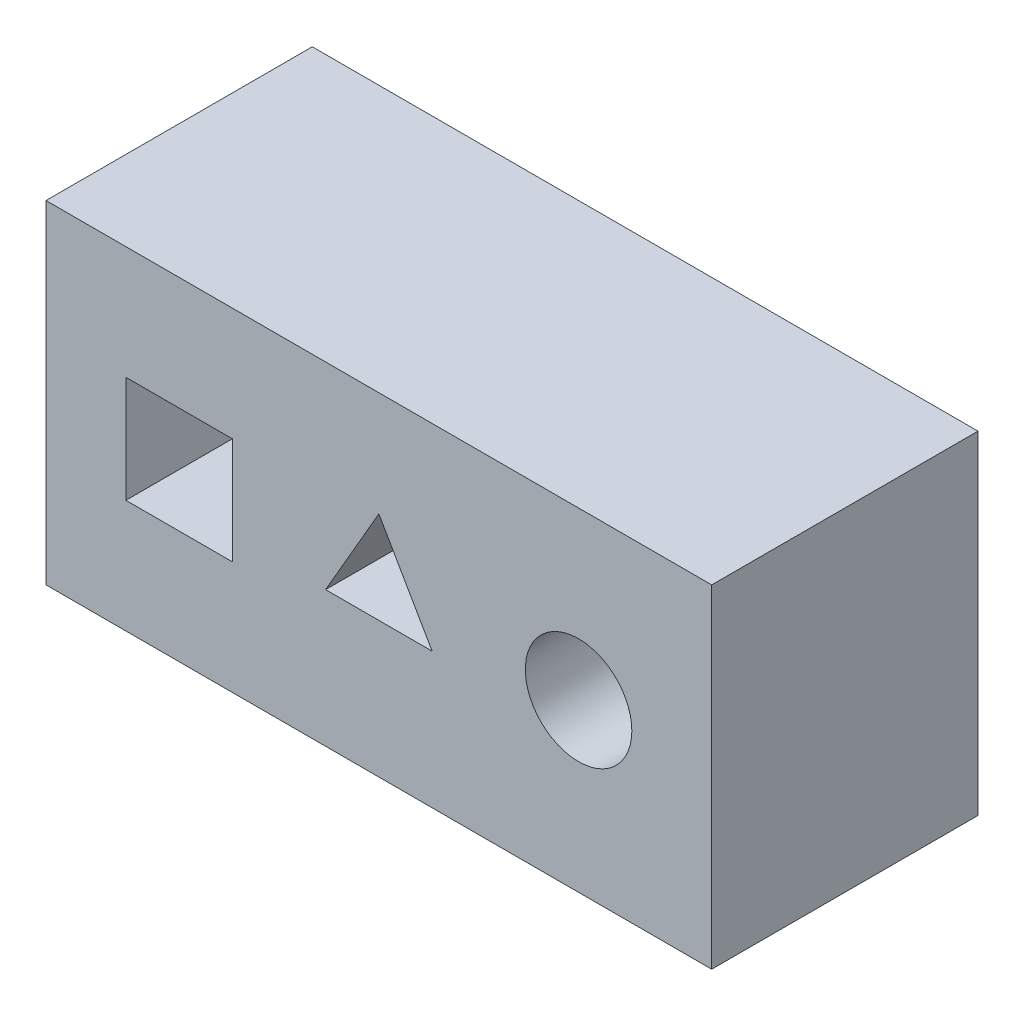
ISO-10303-21;
HEADER;
FILE_DESCRIPTION(('STEP AP214'),'2;1');
FILE_NAME('part.step','',(''),(''),'','','');
FILE_SCHEMA(('AUTOMOTIVE_DESIGN { 1 0 10303 214 1 1 1 1 }'));
ENDSEC;
DATA;
#1=APPLICATION_CONTEXT('core data for automotive mechanical design processes');
#2=APPLICATION_PROTOCOL_DEFINITION('international standard','automotive_design',2000,#1);
#3=PRODUCT_CONTEXT('',#1,'mechanical');
#4=PRODUCT('Part','Part','',(#3));
#5=PRODUCT_RELATED_PRODUCT_CATEGORY('part','',(#4));
#6=PRODUCT_DEFINITION_FORMATION('','',#4);
#7=PRODUCT_DEFINITION_CONTEXT('part definition',#1,'design');
#8=PRODUCT_DEFINITION('design','',#6,#7);
#9=PRODUCT_DEFINITION_SHAPE('','',#8);
#10=(LENGTH_UNIT() NAMED_UNIT(*) SI_UNIT(.MILLI.,.METRE.));
#11=(NAMED_UNIT(*) PLANE_ANGLE_UNIT() SI_UNIT($,.RADIAN.));
#12=(NAMED_UNIT(*) SI_UNIT($,.STERADIAN.) SOLID_ANGLE_UNIT());
#13=UNCERTAINTY_MEASURE_WITH_UNIT(LENGTH_MEASURE(1.E-05),#10,'distance_accuracy_value','');
#14=(GEOMETRIC_REPRESENTATION_CONTEXT(3) GLOBAL_UNCERTAINTY_ASSIGNED_CONTEXT((#13)) GLOBAL_UNIT_ASSIGNED_CONTEXT((#10,
#11,#12)) REPRESENTATION_CONTEXT('',''));
#15=CARTESIAN_POINT('',(0.,0.,0.));
#16=DIRECTION('',(0.,0.,1.));
#17=DIRECTION('',(1.,0.,0.));
#18=AXIS2_PLACEMENT_3D('',#15,#16,#17);
#19=CARTESIAN_POINT('',(0.,0.,100.));
#20=DIRECTION('',(0.,0.,1.));
#21=DIRECTION('',(1.,0.,0.));
#22=AXIS2_PLACEMENT_3D('',#19,#20,#21);
#23=PLANE('',#22);
#24=DIRECTION('',(0.,-1.,0.));
#25=VECTOR('',#24,1.);
#26=CARTESIAN_POINT('',(-125.,-62.5,100.));
#27=LINE('',#26,#25);
#28=CARTESIAN_POINT('',(-125.,62.5,100.));
#29=VERTEX_POINT('',#28);
#30=CARTESIAN_POINT('',(-125.,-62.5,100.));
#31=VERTEX_POINT('',#30);
#32=EDGE_CURVE('E204',#29,#31,#27,.T.);
#33=ORIENTED_EDGE('',*,*,#32,.T.);
#34=DIRECTION('',(1.,0.,0.));
#35=VECTOR('',#34,1.);
#36=CARTESIAN_POINT('',(125.,-62.5,100.));
#37=LINE('',#36,#35);
#38=CARTESIAN_POINT('',(125.,-62.5,100.));
#39=VERTEX_POINT('',#38);
#40=EDGE_CURVE('E92',#31,#39,#37,.T.);
#41=ORIENTED_EDGE('',*,*,#40,.T.);
#42=DIRECTION('',(0.,1.,0.));
#43=VECTOR('',#42,1.);
#44=CARTESIAN_POINT('',(125.,-62.5,100.));
#45=LINE('',#44,#43);
#46=CARTESIAN_POINT('',(125.,62.5,100.));
#47=VERTEX_POINT('',#46);
#48=EDGE_CURVE('E209',#39,#47,#45,.T.);
#49=ORIENTED_EDGE('',*,*,#48,.T.);
#50=DIRECTION('',(-1.,0.,0.));
#51=VECTOR('',#50,1.);
#52=CARTESIAN_POINT('',(125.,62.5,100.));
#53=LINE('',#52,#51);
#54=EDGE_CURVE('E61',#47,#29,#53,.T.);
#55=ORIENTED_EDGE('',*,*,#54,.T.);
#56=EDGE_LOOP('',(#33,#41,#49,#55));
#57=FACE_BOUND('',#56,.T.);
#58=CARTESIAN_POINT('',(74.9999999999999,0.,100.));
#59=DIRECTION('',(0.,0.,1.));
#60=DIRECTION('',(1.,0.,0.));
#61=AXIS2_PLACEMENT_3D('',#58,#59,#60);
#62=CIRCLE('',#61,20.);
#63=CARTESIAN_POINT('',(94.9999999999999,0.,100.));
#64=VERTEX_POINT('',#63);
#65=EDGE_CURVE('E305',#64,#64,#62,.T.);
#66=ORIENTED_EDGE('',*,*,#65,.F.);
#67=EDGE_LOOP('',(#66));
#68=FACE_BOUND('',#67,.T.);
#69=DIRECTION('',(1.,0.,0.));
#70=VECTOR('',#69,1.);
#71=CARTESIAN_POINT('',(0.,20.,100.));
#72=LINE('',#71,#70);
#73=CARTESIAN_POINT('',(-95.,20.,100.));
#74=VERTEX_POINT('',#73);
#75=CARTESIAN_POINT('',(-55.,20.,100.));
#76=VERTEX_POINT('',#75);
#77=EDGE_CURVE('E293',#74,#76,#72,.T.);
#78=ORIENTED_EDGE('',*,*,#77,.T.);
#79=DIRECTION('',(0.,-1.,0.));
#80=VECTOR('',#79,1.);
#81=CARTESIAN_POINT('',(-55.,0.,100.));
#82=LINE('',#81,#80);
#83=CARTESIAN_POINT('',(-55.,-20.,100.));
#84=VERTEX_POINT('',#83);
#85=EDGE_CURVE('E289',#76,#84,#82,.T.);
#86=ORIENTED_EDGE('',*,*,#85,.T.);
#87=DIRECTION('',(1.,0.,0.));
#88=VECTOR('',#87,1.);
#89=CARTESIAN_POINT('',(0.,-20.,100.));
#90=LINE('',#89,#88);
#91=CARTESIAN_POINT('',(-95.,-20.,100.));
#92=VERTEX_POINT('',#91);
#93=EDGE_CURVE('E177',#92,#84,#90,.T.);
#94=ORIENTED_EDGE('',*,*,#93,.F.);
#95=DIRECTION('',(0.,-1.,0.));
#96=VECTOR('',#95,1.);
#97=CARTESIAN_POINT('',(-95.,0.,100.));
#98=LINE('',#97,#96);
#99=EDGE_CURVE('E182',#74,#92,#98,.T.);
#100=ORIENTED_EDGE('',*,*,#99,.F.);
#101=EDGE_LOOP('',(#78,#86,#94,#100));
#102=FACE_BOUND('',#101,.T.);
#103=DIRECTION('',(0.5,-0.866025403784439,0.));
#104=VECTOR('',#103,1.);
#105=CARTESIAN_POINT('',(10.,5.77350269189626,100.));
#106=LINE('',#105,#104);
#107=CARTESIAN_POINT('',(0.,23.094010767585,100.));
#108=VERTEX_POINT('',#107);
#109=CARTESIAN_POINT('',(20.,-11.5470053837925,100.));
#110=VERTEX_POINT('',#109);
#111=EDGE_CURVE('E160',#108,#110,#106,.T.);
#112=ORIENTED_EDGE('',*,*,#111,.T.);
#113=DIRECTION('',(-1.,0.,0.));
#114=VECTOR('',#113,1.);
#115=CARTESIAN_POINT('',(0.,-11.5470053837925,100.));
#116=LINE('',#115,#114);
#117=CARTESIAN_POINT('',(-20.,-11.5470053837925,100.));
#118=VERTEX_POINT('',#117);
#119=EDGE_CURVE('E284',#110,#118,#116,.T.);
#120=ORIENTED_EDGE('',*,*,#119,.T.);
#121=DIRECTION('',(0.5,0.866025403784439,0.));
#122=VECTOR('',#121,1.);
#123=CARTESIAN_POINT('',(-10.,5.77350269189626,100.));
#124=LINE('',#123,#122);
#125=EDGE_CURVE('E148',#118,#108,#124,.T.);
#126=ORIENTED_EDGE('',*,*,#125,.T.);
#127=EDGE_LOOP('',(#112,#120,#126));
#128=FACE_BOUND('',#127,.T.);
#129=ADVANCED_FACE('F43',(#57,#68,#102,#128),#23,.T.);
#130=CARTESIAN_POINT('',(0.,0.,0.));
#131=DIRECTION('',(0.,0.,1.));
#132=DIRECTION('',(1.,0.,0.));
#133=AXIS2_PLACEMENT_3D('',#130,#131,#132);
#134=PLANE('',#133);
#135=DIRECTION('',(0.,-1.,0.));
#136=VECTOR('',#135,1.);
#137=CARTESIAN_POINT('',(-125.,-62.5,0.));
#138=LINE('',#137,#136);
#139=CARTESIAN_POINT('',(-125.,62.5,0.));
#140=VERTEX_POINT('',#139);
#141=CARTESIAN_POINT('',(-125.,-62.5,0.));
#142=VERTEX_POINT('',#141);
#143=EDGE_CURVE('E203',#140,#142,#138,.T.);
#144=ORIENTED_EDGE('',*,*,#143,.F.);
#145=DIRECTION('',(-1.,0.,0.));
#146=VECTOR('',#145,1.);
#147=CARTESIAN_POINT('',(125.,62.5,0.));
#148=LINE('',#147,#146);
#149=CARTESIAN_POINT('',(125.,62.5,0.));
#150=VERTEX_POINT('',#149);
#151=EDGE_CURVE('E85',#150,#140,#148,.T.);
#152=ORIENTED_EDGE('',*,*,#151,.F.);
#153=DIRECTION('',(0.,1.,0.));
#154=VECTOR('',#153,1.);
#155=CARTESIAN_POINT('',(125.,-62.5,0.));
#156=LINE('',#155,#154);
#157=CARTESIAN_POINT('',(125.,-62.5,0.));
#158=VERTEX_POINT('',#157);
#159=EDGE_CURVE('E79',#158,#150,#156,.T.);
#160=ORIENTED_EDGE('',*,*,#159,.F.);
#161=DIRECTION('',(1.,0.,0.));
#162=VECTOR('',#161,1.);
#163=CARTESIAN_POINT('',(125.,-62.5,0.));
#164=LINE('',#163,#162);
#165=EDGE_CURVE('E218',#142,#158,#164,.T.);
#166=ORIENTED_EDGE('',*,*,#165,.F.);
#167=EDGE_LOOP('',(#144,#152,#160,#166));
#168=FACE_BOUND('',#167,.T.);
#169=DIRECTION('',(-0.5,0.866025403784439,0.));
#170=VECTOR('',#169,1.);
#171=CARTESIAN_POINT('',(10.,5.77350269189626,0.));
#172=LINE('',#171,#170);
#173=CARTESIAN_POINT('',(20.,-11.5470053837925,0.));
#174=VERTEX_POINT('',#173);
#175=CARTESIAN_POINT('',(0.,23.094010767585,0.));
#176=VERTEX_POINT('',#175);
#177=EDGE_CURVE('E136',#174,#176,#172,.T.);
#178=ORIENTED_EDGE('',*,*,#177,.T.);
#179=DIRECTION('',(-0.5,-0.866025403784439,0.));
#180=VECTOR('',#179,1.);
#181=CARTESIAN_POINT('',(-10.,5.77350269189626,0.));
#182=LINE('',#181,#180);
#183=CARTESIAN_POINT('',(-20.,-11.5470053837925,-1.11022302462516E-13));
#184=VERTEX_POINT('',#183);
#185=EDGE_CURVE('E140',#176,#184,#182,.T.);
#186=ORIENTED_EDGE('',*,*,#185,.T.);
#187=DIRECTION('',(1.,0.,0.));
#188=VECTOR('',#187,1.);
#189=CARTESIAN_POINT('',(0.,-11.5470053837925,0.));
#190=LINE('',#189,#188);
#191=EDGE_CURVE('E143',#184,#174,#190,.T.);
#192=ORIENTED_EDGE('',*,*,#191,.T.);
#193=EDGE_LOOP('',(#178,#186,#192));
#194=FACE_BOUND('',#193,.T.);
#195=DIRECTION('',(-1.,0.,0.));
#196=VECTOR('',#195,1.);
#197=CARTESIAN_POINT('',(0.,20.,0.));
#198=LINE('',#197,#196);
#199=CARTESIAN_POINT('',(-55.,20.,0.));
#200=VERTEX_POINT('',#199);
#201=CARTESIAN_POINT('',(-95.,20.,0.));
#202=VERTEX_POINT('',#201);
#203=EDGE_CURVE('E191',#200,#202,#198,.T.);
#204=ORIENTED_EDGE('',*,*,#203,.T.);
#205=DIRECTION('',(0.,1.,0.));
#206=VECTOR('',#205,1.);
#207=CARTESIAN_POINT('',(-95.,0.,0.));
#208=LINE('',#207,#206);
#209=CARTESIAN_POINT('',(-95.,-20.,0.));
#210=VERTEX_POINT('',#209);
#211=EDGE_CURVE('E168',#210,#202,#208,.T.);
#212=ORIENTED_EDGE('',*,*,#211,.F.);
#213=DIRECTION('',(-1.,0.,0.));
#214=VECTOR('',#213,1.);
#215=CARTESIAN_POINT('',(0.,-20.,0.));
#216=LINE('',#215,#214);
#217=CARTESIAN_POINT('',(-55.,-20.,-1.11022302462516E-13));
#218=VERTEX_POINT('',#217);
#219=EDGE_CURVE('E186',#218,#210,#216,.T.);
#220=ORIENTED_EDGE('',*,*,#219,.F.);
#221=DIRECTION('',(0.,1.,0.));
#222=VECTOR('',#221,1.);
#223=CARTESIAN_POINT('',(-55.,0.,0.));
#224=LINE('',#223,#222);
#225=EDGE_CURVE('E194',#218,#200,#224,.T.);
#226=ORIENTED_EDGE('',*,*,#225,.T.);
#227=EDGE_LOOP('',(#204,#212,#220,#226));
#228=FACE_BOUND('',#227,.T.);
#229=CARTESIAN_POINT('',(74.9999999999999,0.,0.));
#230=DIRECTION('',(0.,0.,1.));
#231=DIRECTION('',(1.,0.,0.));
#232=AXIS2_PLACEMENT_3D('',#229,#230,#231);
#233=CIRCLE('',#232,20.);
#234=CARTESIAN_POINT('',(94.9999999999999,0.,0.));
#235=VERTEX_POINT('',#234);
#236=EDGE_CURVE('E173',#235,#235,#233,.F.);
#237=ORIENTED_EDGE('',*,*,#236,.F.);
#238=EDGE_LOOP('',(#237));
#239=FACE_BOUND('',#238,.T.);
#240=ADVANCED_FACE('F138',(#168,#194,#228,#239),#134,.F.);
#241=CARTESIAN_POINT('',(-125.,-62.5,100.));
#242=DIRECTION('',(1.,0.,0.));
#243=DIRECTION('',(0.,0.,-1.));
#244=AXIS2_PLACEMENT_3D('',#241,#242,#243);
#245=PLANE('',#244);
#246=ORIENTED_EDGE('',*,*,#143,.T.);
#247=DIRECTION('',(0.,0.,-1.));
#248=VECTOR('',#247,1.);
#249=CARTESIAN_POINT('',(-125.,-62.5,100.));
#250=LINE('',#249,#248);
#251=EDGE_CURVE('E11',#31,#142,#250,.T.);
#252=ORIENTED_EDGE('',*,*,#251,.F.);
#253=ORIENTED_EDGE('',*,*,#32,.F.);
#254=DIRECTION('',(0.,0.,-1.));
#255=VECTOR('',#254,1.);
#256=CARTESIAN_POINT('',(-125.,62.5,100.));
#257=LINE('',#256,#255);
#258=EDGE_CURVE('E214',#29,#140,#257,.T.);
#259=ORIENTED_EDGE('',*,*,#258,.T.);
#260=EDGE_LOOP('',(#246,#252,#253,#259));
#261=FACE_BOUND('',#260,.T.);
#262=ADVANCED_FACE('F45',(#261),#245,.F.);
#263=CARTESIAN_POINT('',(125.,-62.5,100.));
#264=DIRECTION('',(0.,1.,0.));
#265=DIRECTION('',(-1.,0.,0.));
#266=AXIS2_PLACEMENT_3D('',#263,#264,#265);
#267=PLANE('',#266);
#268=ORIENTED_EDGE('',*,*,#165,.T.);
#269=DIRECTION('',(0.,0.,-1.));
#270=VECTOR('',#269,1.);
#271=CARTESIAN_POINT('',(125.,-62.5,100.));
#272=LINE('',#271,#270);
#273=EDGE_CURVE('E53',#39,#158,#272,.T.);
#274=ORIENTED_EDGE('',*,*,#273,.F.);
#275=ORIENTED_EDGE('',*,*,#40,.F.);
#276=ORIENTED_EDGE('',*,*,#251,.T.);
#277=EDGE_LOOP('',(#268,#274,#275,#276));
#278=FACE_BOUND('',#277,.T.);
#279=ADVANCED_FACE('F245',(#278),#267,.F.);
#280=CARTESIAN_POINT('',(125.,-62.5,100.));
#281=DIRECTION('',(-1.,0.,0.));
#282=DIRECTION('',(0.,0.,1.));
#283=AXIS2_PLACEMENT_3D('',#280,#281,#282);
#284=PLANE('',#283);
#285=ORIENTED_EDGE('',*,*,#159,.T.);
#286=DIRECTION('',(0.,0.,-1.));
#287=VECTOR('',#286,1.);
#288=CARTESIAN_POINT('',(125.,62.5,100.));
#289=LINE('',#288,#287);
#290=EDGE_CURVE('E227',#47,#150,#289,.T.);
#291=ORIENTED_EDGE('',*,*,#290,.F.);
#292=ORIENTED_EDGE('',*,*,#48,.F.);
#293=ORIENTED_EDGE('',*,*,#273,.T.);
#294=EDGE_LOOP('',(#285,#291,#292,#293));
#295=FACE_BOUND('',#294,.T.);
#296=ADVANCED_FACE('F231',(#295),#284,.F.);
#297=CARTESIAN_POINT('',(125.,62.5,100.));
#298=DIRECTION('',(0.,-1.,0.));
#299=DIRECTION('',(1.,0.,0.));
#300=AXIS2_PLACEMENT_3D('',#297,#298,#299);
#301=PLANE('',#300);
#302=ORIENTED_EDGE('',*,*,#151,.T.);
#303=ORIENTED_EDGE('',*,*,#258,.F.);
#304=ORIENTED_EDGE('',*,*,#54,.F.);
#305=ORIENTED_EDGE('',*,*,#290,.T.);
#306=EDGE_LOOP('',(#302,#303,#304,#305));
#307=FACE_BOUND('',#306,.T.);
#308=ADVANCED_FACE('F237',(#307),#301,.F.);
#309=CARTESIAN_POINT('',(10.,5.77350269189626,-279.508497187474));
#310=DIRECTION('',(-0.866025403784439,-0.5,0.));
#311=DIRECTION('',(0.5,-0.866025403784439,0.));
#312=AXIS2_PLACEMENT_3D('',#309,#310,#311);
#313=PLANE('',#312);
#314=ORIENTED_EDGE('',*,*,#177,.F.);
#315=DIRECTION('',(0.,0.,1.));
#316=VECTOR('',#315,1.);
#317=CARTESIAN_POINT('',(20.,-11.5470053837925,-279.508497187474));
#318=LINE('',#317,#316);
#319=EDGE_CURVE('E164',#174,#110,#318,.T.);
#320=ORIENTED_EDGE('',*,*,#319,.T.);
#321=ORIENTED_EDGE('',*,*,#111,.F.);
#322=DIRECTION('',(0.,0.,1.));
#323=VECTOR('',#322,1.);
#324=CARTESIAN_POINT('',(0.,23.094010767585,-279.508497187474));
#325=LINE('',#324,#323);
#326=EDGE_CURVE('E153',#176,#108,#325,.T.);
#327=ORIENTED_EDGE('',*,*,#326,.F.);
#328=EDGE_LOOP('',(#314,#320,#321,#327));
#329=FACE_BOUND('',#328,.T.);
#330=ADVANCED_FACE('F158',(#329),#313,.T.);
#331=CARTESIAN_POINT('',(-10.,5.77350269189626,-279.508497187474));
#332=DIRECTION('',(0.866025403784439,-0.5,0.));
#333=DIRECTION('',(0.5,0.866025403784439,0.));
#334=AXIS2_PLACEMENT_3D('',#331,#332,#333);
#335=PLANE('',#334);
#336=ORIENTED_EDGE('',*,*,#185,.F.);
#337=ORIENTED_EDGE('',*,*,#326,.T.);
#338=ORIENTED_EDGE('',*,*,#125,.F.);
#339=DIRECTION('',(0.,0.,1.));
#340=VECTOR('',#339,1.);
#341=CARTESIAN_POINT('',(-20.,-11.5470053837925,-279.508497187474));
#342=LINE('',#341,#340);
#343=EDGE_CURVE('E155',#184,#118,#342,.T.);
#344=ORIENTED_EDGE('',*,*,#343,.F.);
#345=EDGE_LOOP('',(#336,#337,#338,#344));
#346=FACE_BOUND('',#345,.T.);
#347=ADVANCED_FACE('F151',(#346),#335,.T.);
#348=CARTESIAN_POINT('',(0.,20.,-279.508497187474));
#349=DIRECTION('',(0.,-1.,0.));
#350=DIRECTION('',(0.,0.,-1.));
#351=AXIS2_PLACEMENT_3D('',#348,#349,#350);
#352=PLANE('',#351);
#353=ORIENTED_EDGE('',*,*,#203,.F.);
#354=DIRECTION('',(0.,0.,1.));
#355=VECTOR('',#354,1.);
#356=CARTESIAN_POINT('',(-55.,20.,-279.508497187474));
#357=LINE('',#356,#355);
#358=EDGE_CURVE('E163',#200,#76,#357,.T.);
#359=ORIENTED_EDGE('',*,*,#358,.T.);
#360=ORIENTED_EDGE('',*,*,#77,.F.);
#361=DIRECTION('',(0.,0.,1.));
#362=VECTOR('',#361,1.);
#363=CARTESIAN_POINT('',(-95.,20.,-279.508497187474));
#364=LINE('',#363,#362);
#365=EDGE_CURVE('E179',#202,#74,#364,.T.);
#366=ORIENTED_EDGE('',*,*,#365,.F.);
#367=EDGE_LOOP('',(#353,#359,#360,#366));
#368=FACE_BOUND('',#367,.T.);
#369=ADVANCED_FACE('F260',(#368),#352,.T.);
#370=CARTESIAN_POINT('',(-95.,0.,-279.508497187474));
#371=DIRECTION('',(-1.,0.,0.));
#372=DIRECTION('',(0.,0.,1.));
#373=AXIS2_PLACEMENT_3D('',#370,#371,#372);
#374=PLANE('',#373);
#375=DIRECTION('',(0.,0.,1.));
#376=VECTOR('',#375,1.);
#377=CARTESIAN_POINT('',(-95.,-20.,-279.508497187474));
#378=LINE('',#377,#376);
#379=EDGE_CURVE('E183',#210,#92,#378,.T.);
#380=ORIENTED_EDGE('',*,*,#379,.F.);
#381=ORIENTED_EDGE('',*,*,#211,.T.);
#382=ORIENTED_EDGE('',*,*,#365,.T.);
#383=ORIENTED_EDGE('',*,*,#99,.T.);
#384=EDGE_LOOP('',(#380,#381,#382,#383));
#385=FACE_BOUND('',#384,.T.);
#386=ADVANCED_FACE('F263',(#385),#374,.F.);
#387=CARTESIAN_POINT('',(0.,-20.,-279.508497187474));
#388=DIRECTION('',(0.,-1.,0.));
#389=DIRECTION('',(0.,0.,-1.));
#390=AXIS2_PLACEMENT_3D('',#387,#388,#389);
#391=PLANE('',#390);
#392=DIRECTION('',(0.,0.,1.));
#393=VECTOR('',#392,1.);
#394=CARTESIAN_POINT('',(-55.,-20.,-279.508497187474));
#395=LINE('',#394,#393);
#396=EDGE_CURVE('E176',#218,#84,#395,.T.);
#397=ORIENTED_EDGE('',*,*,#396,.F.);
#398=ORIENTED_EDGE('',*,*,#219,.T.);
#399=ORIENTED_EDGE('',*,*,#379,.T.);
#400=ORIENTED_EDGE('',*,*,#93,.T.);
#401=EDGE_LOOP('',(#397,#398,#399,#400));
#402=FACE_BOUND('',#401,.T.);
#403=ADVANCED_FACE('F267',(#402),#391,.F.);
#404=CARTESIAN_POINT('',(0.,-11.5470053837925,-279.508497187474));
#405=DIRECTION('',(0.,1.,0.));
#406=DIRECTION('',(-1.,0.,0.));
#407=AXIS2_PLACEMENT_3D('',#404,#405,#406);
#408=PLANE('',#407);
#409=ORIENTED_EDGE('',*,*,#191,.F.);
#410=ORIENTED_EDGE('',*,*,#343,.T.);
#411=ORIENTED_EDGE('',*,*,#119,.F.);
#412=ORIENTED_EDGE('',*,*,#319,.F.);
#413=EDGE_LOOP('',(#409,#410,#411,#412));
#414=FACE_BOUND('',#413,.T.);
#415=ADVANCED_FACE('F271',(#414),#408,.T.);
#416=CARTESIAN_POINT('',(-55.,0.,-279.508497187474));
#417=DIRECTION('',(-1.,0.,0.));
#418=DIRECTION('',(0.,0.,1.));
#419=AXIS2_PLACEMENT_3D('',#416,#417,#418);
#420=PLANE('',#419);
#421=ORIENTED_EDGE('',*,*,#225,.F.);
#422=ORIENTED_EDGE('',*,*,#396,.T.);
#423=ORIENTED_EDGE('',*,*,#85,.F.);
#424=ORIENTED_EDGE('',*,*,#358,.F.);
#425=EDGE_LOOP('',(#421,#422,#423,#424));
#426=FACE_BOUND('',#425,.T.);
#427=ADVANCED_FACE('F258',(#426),#420,.T.);
#428=CARTESIAN_POINT('',(74.9999999999999,0.,-279.508497187474));
#429=DIRECTION('',(0.,0.,1.));
#430=DIRECTION('',(1.,0.,0.));
#431=AXIS2_PLACEMENT_3D('',#428,#429,#430);
#432=CYLINDRICAL_SURFACE('',#431,20.);
#433=CARTESIAN_POINT('',(94.9999999999999,0.,0.));
#434=CARTESIAN_POINT('',(94.9999999999999,0.,1.04166666666661));
#435=CARTESIAN_POINT('',(94.9999999999999,0.,2.08333333333327));
#436=CARTESIAN_POINT('',(94.9999999999999,0.,4.1666666666666));
#437=CARTESIAN_POINT('',(94.9999999999999,0.,5.20833333333326));
#438=CARTESIAN_POINT('',(94.9999999999999,0.,7.2916666666666));
#439=CARTESIAN_POINT('',(94.9999999999999,0.,8.33333333333329));
#440=CARTESIAN_POINT('',(94.9999999999999,0.,10.4166666666666));
#441=CARTESIAN_POINT('',(94.9999999999999,0.,11.4583333333333));
#442=CARTESIAN_POINT('',(94.9999999999999,0.,13.5416666666666));
#443=CARTESIAN_POINT('',(94.9999999999999,0.,14.5833333333333));
#444=CARTESIAN_POINT('',(94.9999999999999,0.,16.6666666666666));
#445=CARTESIAN_POINT('',(94.9999999999999,0.,17.7083333333333));
#446=CARTESIAN_POINT('',(94.9999999999999,0.,19.7916666666667));
#447=CARTESIAN_POINT('',(94.9999999999999,0.,20.8333333333333));
#448=CARTESIAN_POINT('',(94.9999999999999,0.,22.9166666666666));
#449=CARTESIAN_POINT('',(94.9999999999999,0.,23.9583333333333));
#450=CARTESIAN_POINT('',(94.9999999999999,0.,26.0416666666666));
#451=CARTESIAN_POINT('',(94.9999999999999,0.,27.0833333333333));
#452=CARTESIAN_POINT('',(94.9999999999999,0.,29.1666666666666));
#453=CARTESIAN_POINT('',(94.9999999999999,0.,30.2083333333333));
#454=CARTESIAN_POINT('',(94.9999999999999,0.,32.2916666666666));
#455=CARTESIAN_POINT('',(94.9999999999999,0.,33.3333333333333));
#456=CARTESIAN_POINT('',(94.9999999999999,0.,35.4166666666667));
#457=CARTESIAN_POINT('',(94.9999999999999,0.,36.4583333333333));
#458=CARTESIAN_POINT('',(94.9999999999999,0.,38.5416666666666));
#459=CARTESIAN_POINT('',(94.9999999999999,0.,39.5833333333333));
#460=CARTESIAN_POINT('',(94.9999999999999,0.,41.6666666666667));
#461=CARTESIAN_POINT('',(94.9999999999999,0.,42.7083333333333));
#462=CARTESIAN_POINT('',(94.9999999999999,0.,44.7916666666667));
#463=CARTESIAN_POINT('',(94.9999999999999,0.,45.8333333333333));
#464=CARTESIAN_POINT('',(94.9999999999999,0.,47.9166666666667));
#465=CARTESIAN_POINT('',(94.9999999999999,0.,48.9583333333333));
#466=CARTESIAN_POINT('',(94.9999999999999,0.,51.0416666666667));
#467=CARTESIAN_POINT('',(94.9999999999999,0.,52.0833333333333));
#468=CARTESIAN_POINT('',(94.9999999999999,0.,54.1666666666666));
#469=CARTESIAN_POINT('',(94.9999999999999,0.,55.2083333333333));
#470=CARTESIAN_POINT('',(94.9999999999999,0.,57.2916666666667));
#471=CARTESIAN_POINT('',(94.9999999999999,0.,58.3333333333333));
#472=CARTESIAN_POINT('',(94.9999999999999,0.,60.4166666666667));
#473=CARTESIAN_POINT('',(94.9999999999999,0.,61.4583333333333));
#474=CARTESIAN_POINT('',(94.9999999999999,0.,63.5416666666667));
#475=CARTESIAN_POINT('',(94.9999999999999,0.,64.5833333333333));
#476=CARTESIAN_POINT('',(94.9999999999999,0.,66.6666666666667));
#477=CARTESIAN_POINT('',(94.9999999999999,0.,67.7083333333334));
#478=CARTESIAN_POINT('',(94.9999999999999,0.,69.7916666666667));
#479=CARTESIAN_POINT('',(94.9999999999999,0.,70.8333333333334));
#480=CARTESIAN_POINT('',(94.9999999999999,0.,72.9166666666667));
#481=CARTESIAN_POINT('',(94.9999999999999,0.,73.9583333333333));
#482=CARTESIAN_POINT('',(94.9999999999999,0.,76.0416666666667));
#483=CARTESIAN_POINT('',(94.9999999999999,0.,77.0833333333333));
#484=CARTESIAN_POINT('',(94.9999999999999,0.,79.1666666666667));
#485=CARTESIAN_POINT('',(94.9999999999999,0.,80.2083333333333));
#486=CARTESIAN_POINT('',(94.9999999999999,0.,82.2916666666667));
#487=CARTESIAN_POINT('',(94.9999999999999,0.,83.3333333333334));
#488=CARTESIAN_POINT('',(94.9999999999999,0.,85.4166666666667));
#489=CARTESIAN_POINT('',(94.9999999999999,0.,86.4583333333334));
#490=CARTESIAN_POINT('',(94.9999999999999,0.,88.5416666666667));
#491=CARTESIAN_POINT('',(94.9999999999999,0.,89.5833333333333));
#492=CARTESIAN_POINT('',(94.9999999999999,0.,91.6666666666667));
#493=CARTESIAN_POINT('',(94.9999999999999,0.,92.7083333333334));
#494=CARTESIAN_POINT('',(94.9999999999999,0.,94.7916666666667));
#495=CARTESIAN_POINT('',(94.9999999999999,0.,95.8333333333334));
#496=CARTESIAN_POINT('',(94.9999999999999,0.,97.9166666666667));
#497=CARTESIAN_POINT('',(94.9999999999999,0.,98.9583333333334));
#498=CARTESIAN_POINT('',(94.9999999999999,0.,100.));
#499=B_SPLINE_CURVE_WITH_KNOTS('',3,(#433,#434,#435,#436,#437,#438,#439,#440,#441,#442,#443,
#444,#445,#446,#447,#448,#449,#450,#451,#452,#453,#454,#455,#456,#457,#458,#459,#460,#461,#462,
#463,#464,#465,#466,#467,#468,#469,#470,#471,#472,#473,#474,#475,#476,#477,#478,#479,#480,#481,
#482,#483,#484,#485,#486,#487,#488,#489,#490,#491,#492,#493,#494,#495,#496,#497,#498),
.UNSPECIFIED.,.F.,.F.,(4,2,2,2,2,2,2,2,2,2,2,2,2,2,2,2,2,2,2,2,2,2,2,2,2,2,2,2,2,2,2,2,4),(0.,
3.12499999999999,6.24999999999998,9.37500000000002,12.5,15.625,18.75,21.875,25.,28.125,31.25,
34.375,37.5,40.625,43.7500000000001,46.8750000000001,50.,53.125,56.25,59.3750000000001,
62.5000000000001,65.625,68.7500000000001,71.8750000000001,75.0000000000001,78.1250000000001,
81.25,84.3750000000001,87.5000000000001,90.6250000000001,93.7500000000001,96.8750000000001,
100.),.UNSPECIFIED.);
#500=EDGE_CURVE('BSEAM255',#235,#64,#499,.T.);
#501=ORIENTED_EDGE('',*,*,#236,.T.);
#502=ORIENTED_EDGE('',*,*,#65,.T.);
#503=ORIENTED_EDGE('',*,*,#500,.T.);
#504=ORIENTED_EDGE('',*,*,#500,.F.);
#505=EDGE_LOOP('',(#501,#503,#502,#504));
#506=FACE_BOUND('',#505,.T.);
#507=ADVANCED_FACE('F255',(#506),#432,.F.);
#508=CLOSED_SHELL('',(#129,#240,#262,#279,#296,#308,#330,#347,#369,#386,#403,#415,#427,#507));
#509=MANIFOLD_SOLID_BREP('B2',#508);
#510=ADVANCED_BREP_SHAPE_REPRESENTATION('',(#18,#509),#14);
#511=SHAPE_DEFINITION_REPRESENTATION(#9,#510);
ENDSEC;
END-ISO-10303-21;
